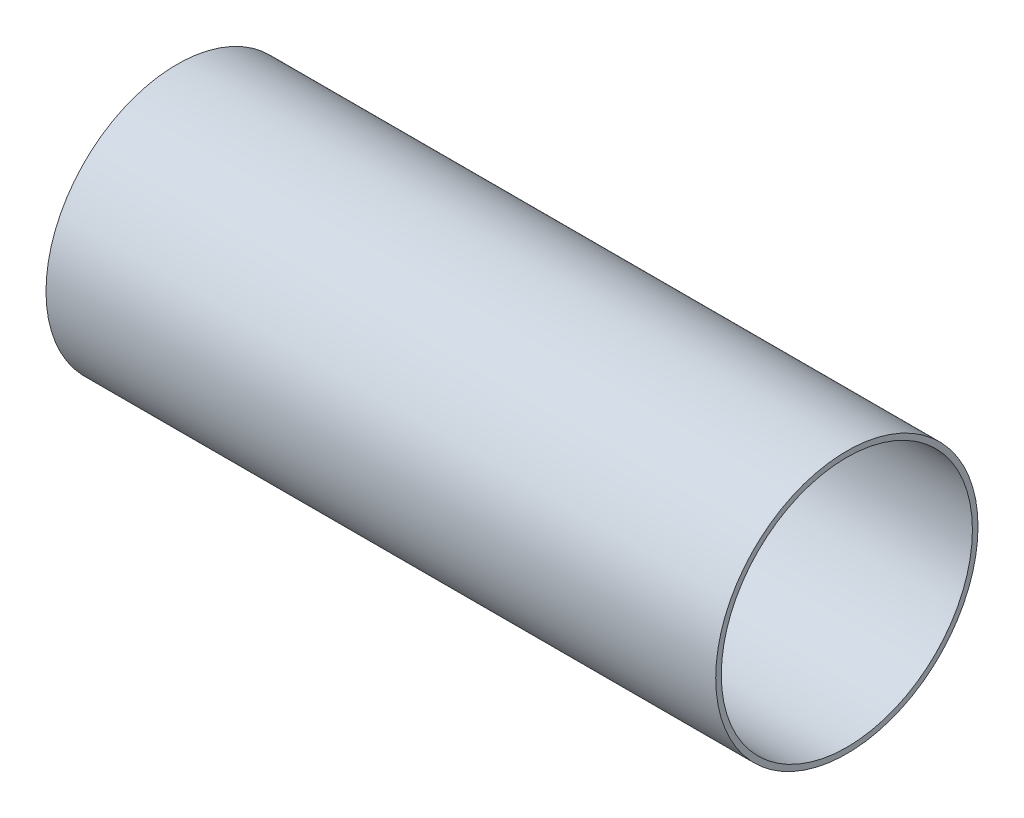
ISO-10303-21;
HEADER;
FILE_DESCRIPTION(('STEP AP214'),'2;1');
FILE_NAME('part.step','',(''),(''),'','','');
FILE_SCHEMA(('AUTOMOTIVE_DESIGN { 1 0 10303 214 1 1 1 1 }'));
ENDSEC;
DATA;
#1=APPLICATION_CONTEXT('core data for automotive mechanical design processes');
#2=APPLICATION_PROTOCOL_DEFINITION('international standard','automotive_design',2000,#1);
#3=PRODUCT_CONTEXT('',#1,'mechanical');
#4=PRODUCT('Part','Part','',(#3));
#5=PRODUCT_RELATED_PRODUCT_CATEGORY('part','',(#4));
#6=PRODUCT_DEFINITION_FORMATION('','',#4);
#7=PRODUCT_DEFINITION_CONTEXT('part definition',#1,'design');
#8=PRODUCT_DEFINITION('design','',#6,#7);
#9=PRODUCT_DEFINITION_SHAPE('','',#8);
#10=(LENGTH_UNIT() NAMED_UNIT(*) SI_UNIT(.MILLI.,.METRE.));
#11=(NAMED_UNIT(*) PLANE_ANGLE_UNIT() SI_UNIT($,.RADIAN.));
#12=(NAMED_UNIT(*) SI_UNIT($,.STERADIAN.) SOLID_ANGLE_UNIT());
#13=UNCERTAINTY_MEASURE_WITH_UNIT(LENGTH_MEASURE(1.E-05),#10,'distance_accuracy_value','');
#14=(GEOMETRIC_REPRESENTATION_CONTEXT(3) GLOBAL_UNCERTAINTY_ASSIGNED_CONTEXT((#13)) GLOBAL_UNIT_ASSIGNED_CONTEXT((#10,
#11,#12)) REPRESENTATION_CONTEXT('',''));
#15=CARTESIAN_POINT('',(0.,0.,0.));
#16=DIRECTION('',(0.,0.,1.));
#17=DIRECTION('',(1.,0.,0.));
#18=AXIS2_PLACEMENT_3D('',#15,#16,#17);
#19=CARTESIAN_POINT('',(304.8,0.,0.));
#20=DIRECTION('',(1.,0.,0.));
#21=DIRECTION('',(0.,0.,-1.));
#22=AXIS2_PLACEMENT_3D('',#19,#20,#21);
#23=PLANE('',#22);
#24=CARTESIAN_POINT('',(304.8,0.,0.));
#25=DIRECTION('',(1.,0.,0.));
#26=DIRECTION('',(0.,0.,-1.));
#27=AXIS2_PLACEMENT_3D('',#24,#25,#26);
#28=CIRCLE('',#27,59.69);
#29=CARTESIAN_POINT('',(304.8,0.,59.69));
#30=VERTEX_POINT('',#29);
#31=EDGE_CURVE('E11',#30,#30,#28,.T.);
#32=ORIENTED_EDGE('',*,*,#31,.T.);
#33=EDGE_LOOP('',(#32));
#34=FACE_BOUND('',#33,.T.);
#35=CARTESIAN_POINT('',(304.8,0.,0.));
#36=DIRECTION('',(1.,0.,0.));
#37=DIRECTION('',(0.,0.,-1.));
#38=AXIS2_PLACEMENT_3D('',#35,#36,#37);
#39=CIRCLE('',#38,57.15);
#40=CARTESIAN_POINT('',(304.8,0.,57.15));
#41=VERTEX_POINT('',#40);
#42=EDGE_CURVE('E48',#41,#41,#39,.T.);
#43=ORIENTED_EDGE('',*,*,#42,.F.);
#44=EDGE_LOOP('',(#43));
#45=FACE_BOUND('',#44,.T.);
#46=ADVANCED_FACE('F37',(#34,#45),#23,.T.);
#47=CARTESIAN_POINT('',(0.,0.,0.));
#48=DIRECTION('',(1.,0.,0.));
#49=DIRECTION('',(0.,0.,-1.));
#50=AXIS2_PLACEMENT_3D('',#47,#48,#49);
#51=PLANE('',#50);
#52=CARTESIAN_POINT('',(0.,0.,0.));
#53=DIRECTION('',(1.,0.,0.));
#54=DIRECTION('',(0.,0.,-1.));
#55=AXIS2_PLACEMENT_3D('',#52,#53,#54);
#56=CIRCLE('',#55,59.69);
#57=CARTESIAN_POINT('',(0.,0.,59.69));
#58=VERTEX_POINT('',#57);
#59=EDGE_CURVE('E41',#58,#58,#56,.T.);
#60=ORIENTED_EDGE('',*,*,#59,.F.);
#61=EDGE_LOOP('',(#60));
#62=FACE_BOUND('',#61,.T.);
#63=CARTESIAN_POINT('',(0.,0.,0.));
#64=DIRECTION('',(1.,0.,0.));
#65=DIRECTION('',(0.,0.,-1.));
#66=AXIS2_PLACEMENT_3D('',#63,#64,#65);
#67=CIRCLE('',#66,57.15);
#68=CARTESIAN_POINT('',(0.,0.,57.15));
#69=VERTEX_POINT('',#68);
#70=EDGE_CURVE('E50',#69,#69,#67,.T.);
#71=ORIENTED_EDGE('',*,*,#70,.T.);
#72=EDGE_LOOP('',(#71));
#73=FACE_BOUND('',#72,.T.);
#74=ADVANCED_FACE('F60',(#62,#73),#51,.F.);
#75=CARTESIAN_POINT('',(304.8,0.,0.));
#76=DIRECTION('',(-1.,0.,0.));
#77=DIRECTION('',(0.,0.,1.));
#78=AXIS2_PLACEMENT_3D('',#75,#76,#77);
#79=CYLINDRICAL_SURFACE('',#78,59.69);
#80=CARTESIAN_POINT('',(304.8,0.,59.69));
#81=CARTESIAN_POINT('',(301.625,0.,59.69));
#82=CARTESIAN_POINT('',(298.45,0.,59.69));
#83=CARTESIAN_POINT('',(292.1,0.,59.69));
#84=CARTESIAN_POINT('',(288.925,0.,59.69));
#85=CARTESIAN_POINT('',(282.575,0.,59.69));
#86=CARTESIAN_POINT('',(279.4,0.,59.69));
#87=CARTESIAN_POINT('',(273.05,0.,59.69));
#88=CARTESIAN_POINT('',(269.875,0.,59.69));
#89=CARTESIAN_POINT('',(263.525,0.,59.69));
#90=CARTESIAN_POINT('',(260.35,0.,59.69));
#91=CARTESIAN_POINT('',(254.,0.,59.69));
#92=CARTESIAN_POINT('',(250.825,0.,59.69));
#93=CARTESIAN_POINT('',(244.475,0.,59.69));
#94=CARTESIAN_POINT('',(241.3,0.,59.69));
#95=CARTESIAN_POINT('',(234.95,0.,59.69));
#96=CARTESIAN_POINT('',(231.775,0.,59.69));
#97=CARTESIAN_POINT('',(225.425,0.,59.69));
#98=CARTESIAN_POINT('',(222.25,0.,59.69));
#99=CARTESIAN_POINT('',(215.9,0.,59.69));
#100=CARTESIAN_POINT('',(212.725,0.,59.69));
#101=CARTESIAN_POINT('',(206.375,0.,59.69));
#102=CARTESIAN_POINT('',(203.2,0.,59.69));
#103=CARTESIAN_POINT('',(196.85,0.,59.69));
#104=CARTESIAN_POINT('',(193.675,0.,59.69));
#105=CARTESIAN_POINT('',(187.325,0.,59.69));
#106=CARTESIAN_POINT('',(184.15,0.,59.69));
#107=CARTESIAN_POINT('',(177.8,0.,59.69));
#108=CARTESIAN_POINT('',(174.625,0.,59.69));
#109=CARTESIAN_POINT('',(168.275,0.,59.69));
#110=CARTESIAN_POINT('',(165.1,0.,59.69));
#111=CARTESIAN_POINT('',(158.75,0.,59.69));
#112=CARTESIAN_POINT('',(155.575,0.,59.69));
#113=CARTESIAN_POINT('',(149.225,0.,59.69));
#114=CARTESIAN_POINT('',(146.05,0.,59.69));
#115=CARTESIAN_POINT('',(139.7,0.,59.69));
#116=CARTESIAN_POINT('',(136.525,0.,59.69));
#117=CARTESIAN_POINT('',(130.175,0.,59.69));
#118=CARTESIAN_POINT('',(127.,0.,59.69));
#119=CARTESIAN_POINT('',(120.65,0.,59.69));
#120=CARTESIAN_POINT('',(117.475,0.,59.69));
#121=CARTESIAN_POINT('',(111.125,0.,59.69));
#122=CARTESIAN_POINT('',(107.95,0.,59.69));
#123=CARTESIAN_POINT('',(101.6,0.,59.69));
#124=CARTESIAN_POINT('',(98.425,0.,59.69));
#125=CARTESIAN_POINT('',(92.075,0.,59.69));
#126=CARTESIAN_POINT('',(88.9,0.,59.69));
#127=CARTESIAN_POINT('',(82.55,0.,59.69));
#128=CARTESIAN_POINT('',(79.375,0.,59.69));
#129=CARTESIAN_POINT('',(73.025,0.,59.69));
#130=CARTESIAN_POINT('',(69.85,0.,59.69));
#131=CARTESIAN_POINT('',(63.5,0.,59.69));
#132=CARTESIAN_POINT('',(60.325,0.,59.69));
#133=CARTESIAN_POINT('',(53.975,0.,59.69));
#134=CARTESIAN_POINT('',(50.8,0.,59.69));
#135=CARTESIAN_POINT('',(44.45,0.,59.69));
#136=CARTESIAN_POINT('',(41.275,0.,59.69));
#137=CARTESIAN_POINT('',(34.925,0.,59.69));
#138=CARTESIAN_POINT('',(31.75,0.,59.69));
#139=CARTESIAN_POINT('',(25.4,0.,59.69));
#140=CARTESIAN_POINT('',(22.225,0.,59.69));
#141=CARTESIAN_POINT('',(15.875,0.,59.69));
#142=CARTESIAN_POINT('',(12.7,0.,59.69));
#143=CARTESIAN_POINT('',(6.35,0.,59.69));
#144=CARTESIAN_POINT('',(3.175,0.,59.69));
#145=CARTESIAN_POINT('',(0.,0.,59.69));
#146=B_SPLINE_CURVE_WITH_KNOTS('',3,(#80,#81,#82,#83,#84,#85,#86,#87,#88,#89,#90,#91,#92,#93,
#94,#95,#96,#97,#98,#99,#100,#101,#102,#103,#104,#105,#106,#107,#108,#109,#110,#111,#112,#113,
#114,#115,#116,#117,#118,#119,#120,#121,#122,#123,#124,#125,#126,#127,#128,#129,#130,#131,#132,
#133,#134,#135,#136,#137,#138,#139,#140,#141,#142,#143,#144,#145),.UNSPECIFIED.,.F.,.F.,(4,2,2,
2,2,2,2,2,2,2,2,2,2,2,2,2,2,2,2,2,2,2,2,2,2,2,2,2,2,2,2,2,4),(0.,9.52500000000001,19.05,28.575,
38.1,47.625,57.15,66.675,76.2,85.7250000000001,95.2500000000001,104.775,114.3,123.825,133.35,
142.875,152.4,161.925,171.45,180.975,190.5,200.025,209.55,219.075,228.6,238.125,247.65,257.175,
266.7,276.225,285.75,295.275,304.8),.UNSPECIFIED.);
#147=EDGE_CURVE('BSEAM39',#30,#58,#146,.T.);
#148=ORIENTED_EDGE('',*,*,#31,.F.);
#149=ORIENTED_EDGE('',*,*,#59,.T.);
#150=ORIENTED_EDGE('',*,*,#147,.T.);
#151=ORIENTED_EDGE('',*,*,#147,.F.);
#152=EDGE_LOOP('',(#148,#150,#149,#151));
#153=FACE_BOUND('',#152,.T.);
#154=ADVANCED_FACE('F39',(#153),#79,.T.);
#155=CARTESIAN_POINT('',(304.8,0.,0.));
#156=DIRECTION('',(-1.,0.,0.));
#157=DIRECTION('',(0.,0.,1.));
#158=AXIS2_PLACEMENT_3D('',#155,#156,#157);
#159=CYLINDRICAL_SURFACE('',#158,57.15);
#160=CARTESIAN_POINT('',(304.8,0.,57.15));
#161=CARTESIAN_POINT('',(301.625,0.,57.15));
#162=CARTESIAN_POINT('',(298.45,0.,57.15));
#163=CARTESIAN_POINT('',(292.1,0.,57.15));
#164=CARTESIAN_POINT('',(288.925,0.,57.15));
#165=CARTESIAN_POINT('',(282.575,0.,57.15));
#166=CARTESIAN_POINT('',(279.4,0.,57.15));
#167=CARTESIAN_POINT('',(273.05,0.,57.15));
#168=CARTESIAN_POINT('',(269.875,0.,57.15));
#169=CARTESIAN_POINT('',(263.525,0.,57.15));
#170=CARTESIAN_POINT('',(260.35,0.,57.15));
#171=CARTESIAN_POINT('',(254.,0.,57.15));
#172=CARTESIAN_POINT('',(250.825,0.,57.15));
#173=CARTESIAN_POINT('',(244.475,0.,57.15));
#174=CARTESIAN_POINT('',(241.3,0.,57.15));
#175=CARTESIAN_POINT('',(234.95,0.,57.15));
#176=CARTESIAN_POINT('',(231.775,0.,57.15));
#177=CARTESIAN_POINT('',(225.425,0.,57.15));
#178=CARTESIAN_POINT('',(222.25,0.,57.15));
#179=CARTESIAN_POINT('',(215.9,0.,57.15));
#180=CARTESIAN_POINT('',(212.725,0.,57.15));
#181=CARTESIAN_POINT('',(206.375,0.,57.15));
#182=CARTESIAN_POINT('',(203.2,0.,57.15));
#183=CARTESIAN_POINT('',(196.85,0.,57.15));
#184=CARTESIAN_POINT('',(193.675,0.,57.15));
#185=CARTESIAN_POINT('',(187.325,0.,57.15));
#186=CARTESIAN_POINT('',(184.15,0.,57.15));
#187=CARTESIAN_POINT('',(177.8,0.,57.15));
#188=CARTESIAN_POINT('',(174.625,0.,57.15));
#189=CARTESIAN_POINT('',(168.275,0.,57.15));
#190=CARTESIAN_POINT('',(165.1,0.,57.15));
#191=CARTESIAN_POINT('',(158.75,0.,57.15));
#192=CARTESIAN_POINT('',(155.575,0.,57.15));
#193=CARTESIAN_POINT('',(149.225,0.,57.15));
#194=CARTESIAN_POINT('',(146.05,0.,57.15));
#195=CARTESIAN_POINT('',(139.7,0.,57.15));
#196=CARTESIAN_POINT('',(136.525,0.,57.15));
#197=CARTESIAN_POINT('',(130.175,0.,57.15));
#198=CARTESIAN_POINT('',(127.,0.,57.15));
#199=CARTESIAN_POINT('',(120.65,0.,57.15));
#200=CARTESIAN_POINT('',(117.475,0.,57.15));
#201=CARTESIAN_POINT('',(111.125,0.,57.15));
#202=CARTESIAN_POINT('',(107.95,0.,57.15));
#203=CARTESIAN_POINT('',(101.6,0.,57.15));
#204=CARTESIAN_POINT('',(98.425,0.,57.15));
#205=CARTESIAN_POINT('',(92.075,0.,57.15));
#206=CARTESIAN_POINT('',(88.9,0.,57.15));
#207=CARTESIAN_POINT('',(82.55,0.,57.15));
#208=CARTESIAN_POINT('',(79.375,0.,57.15));
#209=CARTESIAN_POINT('',(73.025,0.,57.15));
#210=CARTESIAN_POINT('',(69.85,0.,57.15));
#211=CARTESIAN_POINT('',(63.5,0.,57.15));
#212=CARTESIAN_POINT('',(60.325,0.,57.15));
#213=CARTESIAN_POINT('',(53.975,0.,57.15));
#214=CARTESIAN_POINT('',(50.8,0.,57.15));
#215=CARTESIAN_POINT('',(44.45,0.,57.15));
#216=CARTESIAN_POINT('',(41.275,0.,57.15));
#217=CARTESIAN_POINT('',(34.925,0.,57.15));
#218=CARTESIAN_POINT('',(31.75,0.,57.15));
#219=CARTESIAN_POINT('',(25.4,0.,57.15));
#220=CARTESIAN_POINT('',(22.225,0.,57.15));
#221=CARTESIAN_POINT('',(15.875,0.,57.15));
#222=CARTESIAN_POINT('',(12.7,0.,57.15));
#223=CARTESIAN_POINT('',(6.35,0.,57.15));
#224=CARTESIAN_POINT('',(3.175,0.,57.15));
#225=CARTESIAN_POINT('',(0.,0.,57.15));
#226=B_SPLINE_CURVE_WITH_KNOTS('',3,(#160,#161,#162,#163,#164,#165,#166,#167,#168,#169,#170,
#171,#172,#173,#174,#175,#176,#177,#178,#179,#180,#181,#182,#183,#184,#185,#186,#187,#188,#189,
#190,#191,#192,#193,#194,#195,#196,#197,#198,#199,#200,#201,#202,#203,#204,#205,#206,#207,#208,
#209,#210,#211,#212,#213,#214,#215,#216,#217,#218,#219,#220,#221,#222,#223,#224,#225),
.UNSPECIFIED.,.F.,.F.,(4,2,2,2,2,2,2,2,2,2,2,2,2,2,2,2,2,2,2,2,2,2,2,2,2,2,2,2,2,2,2,2,4),(0.,
9.52500000000001,19.05,28.575,38.1,47.625,57.15,66.675,76.2,85.7250000000001,95.2500000000001,
104.775,114.3,123.825,133.35,142.875,152.4,161.925,171.45,180.975,190.5,200.025,209.55,219.075,
228.6,238.125,247.65,257.175,266.7,276.225,285.75,295.275,304.8),.UNSPECIFIED.);
#227=EDGE_CURVE('BSEAM56',#41,#69,#226,.T.);
#228=ORIENTED_EDGE('',*,*,#42,.T.);
#229=ORIENTED_EDGE('',*,*,#70,.F.);
#230=ORIENTED_EDGE('',*,*,#227,.T.);
#231=ORIENTED_EDGE('',*,*,#227,.F.);
#232=EDGE_LOOP('',(#228,#230,#229,#231));
#233=FACE_BOUND('',#232,.T.);
#234=ADVANCED_FACE('F56',(#233),#159,.F.);
#235=CLOSED_SHELL('',(#46,#74,#154,#234));
#236=MANIFOLD_SOLID_BREP('B2',#235);
#237=ADVANCED_BREP_SHAPE_REPRESENTATION('',(#18,#236),#14);
#238=SHAPE_DEFINITION_REPRESENTATION(#9,#237);
ENDSEC;
END-ISO-10303-21;
